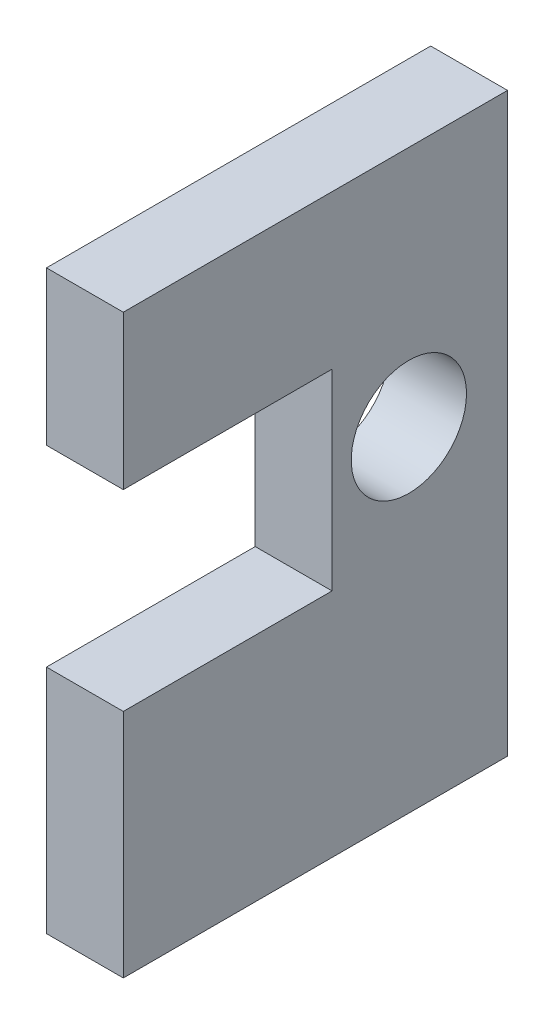
ISO-10303-21;
HEADER;
FILE_DESCRIPTION(('STEP AP214'),'2;1');
FILE_NAME('part.step','',(''),(''),'','','');
FILE_SCHEMA(('AUTOMOTIVE_DESIGN { 1 0 10303 214 1 1 1 1 }'));
ENDSEC;
DATA;
#1=APPLICATION_CONTEXT('core data for automotive mechanical design processes');
#2=APPLICATION_PROTOCOL_DEFINITION('international standard','automotive_design',2000,#1);
#3=PRODUCT_CONTEXT('',#1,'mechanical');
#4=PRODUCT('Part','Part','',(#3));
#5=PRODUCT_RELATED_PRODUCT_CATEGORY('part','',(#4));
#6=PRODUCT_DEFINITION_FORMATION('','',#4);
#7=PRODUCT_DEFINITION_CONTEXT('part definition',#1,'design');
#8=PRODUCT_DEFINITION('design','',#6,#7);
#9=PRODUCT_DEFINITION_SHAPE('','',#8);
#10=(LENGTH_UNIT() NAMED_UNIT(*) SI_UNIT(.MILLI.,.METRE.));
#11=(NAMED_UNIT(*) PLANE_ANGLE_UNIT() SI_UNIT($,.RADIAN.));
#12=(NAMED_UNIT(*) SI_UNIT($,.STERADIAN.) SOLID_ANGLE_UNIT());
#13=UNCERTAINTY_MEASURE_WITH_UNIT(LENGTH_MEASURE(1.E-05),#10,'distance_accuracy_value','');
#14=(GEOMETRIC_REPRESENTATION_CONTEXT(3) GLOBAL_UNCERTAINTY_ASSIGNED_CONTEXT((#13)) GLOBAL_UNIT_ASSIGNED_CONTEXT((#10,
#11,#12)) REPRESENTATION_CONTEXT('',''));
#15=CARTESIAN_POINT('',(0.,0.,0.));
#16=DIRECTION('',(0.,0.,1.));
#17=DIRECTION('',(1.,0.,0.));
#18=AXIS2_PLACEMENT_3D('',#15,#16,#17);
#19=CARTESIAN_POINT('',(2.,0.,0.));
#20=DIRECTION('',(1.,0.,0.));
#21=DIRECTION('',(0.,0.,-1.));
#22=AXIS2_PLACEMENT_3D('',#19,#20,#21);
#23=PLANE('',#22);
#24=DIRECTION('',(0.,1.,0.));
#25=VECTOR('',#24,1.);
#26=CARTESIAN_POINT('',(2.,-12.9799427142259,-5.));
#27=LINE('',#26,#25);
#28=CARTESIAN_POINT('',(2.,-12.9799427142259,-5.));
#29=VERTEX_POINT('',#28);
#30=CARTESIAN_POINT('',(2.,2.02702702702703,-5.));
#31=VERTEX_POINT('',#30);
#32=EDGE_CURVE('E164',#29,#31,#27,.T.);
#33=ORIENTED_EDGE('',*,*,#32,.T.);
#34=DIRECTION('',(0.,0.,1.));
#35=VECTOR('',#34,1.);
#36=CARTESIAN_POINT('',(2.,2.02702702702703,-5.));
#37=LINE('',#36,#35);
#38=CARTESIAN_POINT('',(2.,2.02702702702703,5.));
#39=VERTEX_POINT('',#38);
#40=EDGE_CURVE('E100',#31,#39,#37,.T.);
#41=ORIENTED_EDGE('',*,*,#40,.T.);
#42=DIRECTION('',(0.,-1.,0.));
#43=VECTOR('',#42,1.);
#44=CARTESIAN_POINT('',(2.,-1.97297297297297,5.));
#45=LINE('',#44,#43);
#46=CARTESIAN_POINT('',(2.,-1.97297297297297,5.));
#47=VERTEX_POINT('',#46);
#48=EDGE_CURVE('E185',#39,#47,#45,.T.);
#49=ORIENTED_EDGE('',*,*,#48,.T.);
#50=DIRECTION('',(0.,0.,-1.));
#51=VECTOR('',#50,1.);
#52=CARTESIAN_POINT('',(2.,-1.97297297297297,-0.432432432432427));
#53=LINE('',#52,#51);
#54=CARTESIAN_POINT('',(2.,-1.97297297297297,-0.432432432432427));
#55=VERTEX_POINT('',#54);
#56=EDGE_CURVE('E199',#47,#55,#53,.T.);
#57=ORIENTED_EDGE('',*,*,#56,.T.);
#58=DIRECTION('',(0.,-1.,0.));
#59=VECTOR('',#58,1.);
#60=CARTESIAN_POINT('',(2.,-6.97149936998687,-0.432432432432427));
#61=LINE('',#60,#59);
#62=CARTESIAN_POINT('',(2.,-6.97149936998687,-0.432432432432427));
#63=VERTEX_POINT('',#62);
#64=EDGE_CURVE('E119',#55,#63,#61,.T.);
#65=ORIENTED_EDGE('',*,*,#64,.T.);
#66=DIRECTION('',(0.,0.,1.));
#67=VECTOR('',#66,1.);
#68=CARTESIAN_POINT('',(2.,-6.97149936998687,-0.432432432432427));
#69=LINE('',#68,#67);
#70=CARTESIAN_POINT('',(2.,-6.97149936998687,5.));
#71=VERTEX_POINT('',#70);
#72=EDGE_CURVE('E113',#63,#71,#69,.T.);
#73=ORIENTED_EDGE('',*,*,#72,.T.);
#74=DIRECTION('',(0.,-1.,0.));
#75=VECTOR('',#74,1.);
#76=CARTESIAN_POINT('',(2.,-12.9799427142259,5.));
#77=LINE('',#76,#75);
#78=CARTESIAN_POINT('',(2.,-12.9799427142259,5.));
#79=VERTEX_POINT('',#78);
#80=EDGE_CURVE('E117',#71,#79,#77,.T.);
#81=ORIENTED_EDGE('',*,*,#80,.T.);
#82=DIRECTION('',(0.,0.,-1.));
#83=VECTOR('',#82,1.);
#84=CARTESIAN_POINT('',(2.,-12.9799427142259,-5.));
#85=LINE('',#84,#83);
#86=EDGE_CURVE('E57',#79,#29,#85,.T.);
#87=ORIENTED_EDGE('',*,*,#86,.T.);
#88=EDGE_LOOP('',(#33,#41,#49,#57,#65,#73,#81,#87));
#89=FACE_BOUND('',#88,.T.);
#90=CARTESIAN_POINT('',(2.,-4.27297297297297,-2.43243243243243));
#91=DIRECTION('',(1.,0.,0.));
#92=DIRECTION('',(0.,0.,-1.));
#93=AXIS2_PLACEMENT_3D('',#90,#91,#92);
#94=CIRCLE('',#93,1.5);
#95=CARTESIAN_POINT('',(2.,-4.27297297297297,-3.93243243243243));
#96=VERTEX_POINT('',#95);
#97=EDGE_CURVE('E146',#96,#96,#94,.T.);
#98=ORIENTED_EDGE('',*,*,#97,.F.);
#99=EDGE_LOOP('',(#98));
#100=FACE_BOUND('',#99,.T.);
#101=ADVANCED_FACE('F39',(#89,#100),#23,.T.);
#102=CARTESIAN_POINT('',(0.,0.,0.));
#103=DIRECTION('',(1.,0.,0.));
#104=DIRECTION('',(0.,0.,-1.));
#105=AXIS2_PLACEMENT_3D('',#102,#103,#104);
#106=PLANE('',#105);
#107=DIRECTION('',(0.,1.,0.));
#108=VECTOR('',#107,1.);
#109=CARTESIAN_POINT('',(0.,-12.9799427142259,-5.));
#110=LINE('',#109,#108);
#111=CARTESIAN_POINT('',(0.,-12.9799427142259,-5.));
#112=VERTEX_POINT('',#111);
#113=CARTESIAN_POINT('',(0.,2.02702702702703,-5.));
#114=VERTEX_POINT('',#113);
#115=EDGE_CURVE('E141',#112,#114,#110,.T.);
#116=ORIENTED_EDGE('',*,*,#115,.F.);
#117=DIRECTION('',(0.,0.,-1.));
#118=VECTOR('',#117,1.);
#119=CARTESIAN_POINT('',(0.,-12.9799427142259,-5.));
#120=LINE('',#119,#118);
#121=CARTESIAN_POINT('',(0.,-12.9799427142259,5.));
#122=VERTEX_POINT('',#121);
#123=EDGE_CURVE('E92',#122,#112,#120,.T.);
#124=ORIENTED_EDGE('',*,*,#123,.F.);
#125=DIRECTION('',(0.,-1.,0.));
#126=VECTOR('',#125,1.);
#127=CARTESIAN_POINT('',(0.,-12.9799427142259,5.));
#128=LINE('',#127,#126);
#129=CARTESIAN_POINT('',(0.,-6.97149936998687,5.));
#130=VERTEX_POINT('',#129);
#131=EDGE_CURVE('E86',#130,#122,#128,.T.);
#132=ORIENTED_EDGE('',*,*,#131,.F.);
#133=DIRECTION('',(0.,0.,1.));
#134=VECTOR('',#133,1.);
#135=CARTESIAN_POINT('',(0.,-6.97149936998687,-0.432432432432427));
#136=LINE('',#135,#134);
#137=CARTESIAN_POINT('',(0.,-6.97149936998687,-0.432432432432427));
#138=VERTEX_POINT('',#137);
#139=EDGE_CURVE('E128',#138,#130,#136,.T.);
#140=ORIENTED_EDGE('',*,*,#139,.F.);
#141=DIRECTION('',(0.,-1.,0.));
#142=VECTOR('',#141,1.);
#143=CARTESIAN_POINT('',(0.,-6.97149936998687,-0.432432432432427));
#144=LINE('',#143,#142);
#145=CARTESIAN_POINT('',(0.,-1.97297297297297,-0.432432432432427));
#146=VERTEX_POINT('',#145);
#147=EDGE_CURVE('E155',#146,#138,#144,.T.);
#148=ORIENTED_EDGE('',*,*,#147,.F.);
#149=DIRECTION('',(0.,0.,-1.));
#150=VECTOR('',#149,1.);
#151=CARTESIAN_POINT('',(0.,-1.97297297297297,-0.432432432432427));
#152=LINE('',#151,#150);
#153=CARTESIAN_POINT('',(0.,-1.97297297297297,5.));
#154=VERTEX_POINT('',#153);
#155=EDGE_CURVE('E152',#154,#146,#152,.T.);
#156=ORIENTED_EDGE('',*,*,#155,.F.);
#157=DIRECTION('',(0.,-1.,0.));
#158=VECTOR('',#157,1.);
#159=CARTESIAN_POINT('',(0.,-1.97297297297297,5.));
#160=LINE('',#159,#158);
#161=CARTESIAN_POINT('',(0.,2.02702702702703,5.));
#162=VERTEX_POINT('',#161);
#163=EDGE_CURVE('E149',#162,#154,#160,.T.);
#164=ORIENTED_EDGE('',*,*,#163,.F.);
#165=DIRECTION('',(0.,0.,1.));
#166=VECTOR('',#165,1.);
#167=CARTESIAN_POINT('',(0.,2.02702702702703,-5.));
#168=LINE('',#167,#166);
#169=EDGE_CURVE('E145',#114,#162,#168,.T.);
#170=ORIENTED_EDGE('',*,*,#169,.F.);
#171=EDGE_LOOP('',(#116,#124,#132,#140,#148,#156,#164,#170));
#172=FACE_BOUND('',#171,.T.);
#173=CARTESIAN_POINT('',(0.,-4.27297297297297,-2.43243243243243));
#174=DIRECTION('',(1.,0.,0.));
#175=DIRECTION('',(0.,0.,-1.));
#176=AXIS2_PLACEMENT_3D('',#173,#174,#175);
#177=CIRCLE('',#176,1.5);
#178=CARTESIAN_POINT('',(0.,-4.27297297297297,-3.93243243243243));
#179=VERTEX_POINT('',#178);
#180=EDGE_CURVE('E209',#179,#179,#177,.T.);
#181=ORIENTED_EDGE('',*,*,#180,.T.);
#182=EDGE_LOOP('',(#181));
#183=FACE_BOUND('',#182,.T.);
#184=ADVANCED_FACE('F189',(#172,#183),#106,.F.);
#185=CARTESIAN_POINT('',(2.,-12.9799427142259,-5.));
#186=DIRECTION('',(0.,0.,1.));
#187=DIRECTION('',(0.,-1.,0.));
#188=AXIS2_PLACEMENT_3D('',#185,#186,#187);
#189=PLANE('',#188);
#190=ORIENTED_EDGE('',*,*,#115,.T.);
#191=DIRECTION('',(-1.,0.,0.));
#192=VECTOR('',#191,1.);
#193=CARTESIAN_POINT('',(2.,2.02702702702703,-5.));
#194=LINE('',#193,#192);
#195=EDGE_CURVE('E11',#31,#114,#194,.T.);
#196=ORIENTED_EDGE('',*,*,#195,.F.);
#197=ORIENTED_EDGE('',*,*,#32,.F.);
#198=DIRECTION('',(-1.,0.,0.));
#199=VECTOR('',#198,1.);
#200=CARTESIAN_POINT('',(2.,-12.9799427142259,-5.));
#201=LINE('',#200,#199);
#202=EDGE_CURVE('E137',#29,#112,#201,.T.);
#203=ORIENTED_EDGE('',*,*,#202,.T.);
#204=EDGE_LOOP('',(#190,#196,#197,#203));
#205=FACE_BOUND('',#204,.T.);
#206=ADVANCED_FACE('F41',(#205),#189,.F.);
#207=CARTESIAN_POINT('',(2.,2.02702702702703,-5.));
#208=DIRECTION('',(0.,-1.,0.));
#209=DIRECTION('',(0.,0.,-1.));
#210=AXIS2_PLACEMENT_3D('',#207,#208,#209);
#211=PLANE('',#210);
#212=ORIENTED_EDGE('',*,*,#169,.T.);
#213=DIRECTION('',(-1.,0.,0.));
#214=VECTOR('',#213,1.);
#215=CARTESIAN_POINT('',(2.,2.02702702702703,5.));
#216=LINE('',#215,#214);
#217=EDGE_CURVE('E49',#39,#162,#216,.T.);
#218=ORIENTED_EDGE('',*,*,#217,.F.);
#219=ORIENTED_EDGE('',*,*,#40,.F.);
#220=ORIENTED_EDGE('',*,*,#195,.T.);
#221=EDGE_LOOP('',(#212,#218,#219,#220));
#222=FACE_BOUND('',#221,.T.);
#223=ADVANCED_FACE('F239',(#222),#211,.F.);
#224=CARTESIAN_POINT('',(2.,-1.97297297297297,5.));
#225=DIRECTION('',(0.,0.,-1.));
#226=DIRECTION('',(0.,1.,0.));
#227=AXIS2_PLACEMENT_3D('',#224,#225,#226);
#228=PLANE('',#227);
#229=ORIENTED_EDGE('',*,*,#163,.T.);
#230=DIRECTION('',(-1.,0.,0.));
#231=VECTOR('',#230,1.);
#232=CARTESIAN_POINT('',(2.,-1.97297297297297,5.));
#233=LINE('',#232,#231);
#234=EDGE_CURVE('E175',#47,#154,#233,.T.);
#235=ORIENTED_EDGE('',*,*,#234,.F.);
#236=ORIENTED_EDGE('',*,*,#48,.F.);
#237=ORIENTED_EDGE('',*,*,#217,.T.);
#238=EDGE_LOOP('',(#229,#235,#236,#237));
#239=FACE_BOUND('',#238,.T.);
#240=ADVANCED_FACE('F183',(#239),#228,.F.);
#241=CARTESIAN_POINT('',(2.,-1.97297297297297,-0.432432432432427));
#242=DIRECTION('',(0.,1.,0.));
#243=DIRECTION('',(0.,0.,1.));
#244=AXIS2_PLACEMENT_3D('',#241,#242,#243);
#245=PLANE('',#244);
#246=ORIENTED_EDGE('',*,*,#155,.T.);
#247=DIRECTION('',(-1.,0.,0.));
#248=VECTOR('',#247,1.);
#249=CARTESIAN_POINT('',(2.,-1.97297297297297,-0.432432432432427));
#250=LINE('',#249,#248);
#251=EDGE_CURVE('E171',#55,#146,#250,.T.);
#252=ORIENTED_EDGE('',*,*,#251,.F.);
#253=ORIENTED_EDGE('',*,*,#56,.F.);
#254=ORIENTED_EDGE('',*,*,#234,.T.);
#255=EDGE_LOOP('',(#246,#252,#253,#254));
#256=FACE_BOUND('',#255,.T.);
#257=ADVANCED_FACE('F194',(#256),#245,.F.);
#258=CARTESIAN_POINT('',(2.,-6.97149936998687,-0.432432432432427));
#259=DIRECTION('',(0.,0.,-1.));
#260=DIRECTION('',(0.,1.,0.));
#261=AXIS2_PLACEMENT_3D('',#258,#259,#260);
#262=PLANE('',#261);
#263=ORIENTED_EDGE('',*,*,#147,.T.);
#264=DIRECTION('',(-1.,0.,0.));
#265=VECTOR('',#264,1.);
#266=CARTESIAN_POINT('',(2.,-6.97149936998687,-0.432432432432427));
#267=LINE('',#266,#265);
#268=EDGE_CURVE('E130',#63,#138,#267,.T.);
#269=ORIENTED_EDGE('',*,*,#268,.F.);
#270=ORIENTED_EDGE('',*,*,#64,.F.);
#271=ORIENTED_EDGE('',*,*,#251,.T.);
#272=EDGE_LOOP('',(#263,#269,#270,#271));
#273=FACE_BOUND('',#272,.T.);
#274=ADVANCED_FACE('F197',(#273),#262,.F.);
#275=CARTESIAN_POINT('',(2.,-6.97149936998687,-0.432432432432427));
#276=DIRECTION('',(0.,-1.,0.));
#277=DIRECTION('',(0.,0.,-1.));
#278=AXIS2_PLACEMENT_3D('',#275,#276,#277);
#279=PLANE('',#278);
#280=ORIENTED_EDGE('',*,*,#139,.T.);
#281=DIRECTION('',(-1.,0.,0.));
#282=VECTOR('',#281,1.);
#283=CARTESIAN_POINT('',(2.,-6.97149936998687,5.));
#284=LINE('',#283,#282);
#285=EDGE_CURVE('E125',#71,#130,#284,.T.);
#286=ORIENTED_EDGE('',*,*,#285,.F.);
#287=ORIENTED_EDGE('',*,*,#72,.F.);
#288=ORIENTED_EDGE('',*,*,#268,.T.);
#289=EDGE_LOOP('',(#280,#286,#287,#288));
#290=FACE_BOUND('',#289,.T.);
#291=ADVANCED_FACE('F126',(#290),#279,.F.);
#292=CARTESIAN_POINT('',(2.,-12.9799427142259,5.));
#293=DIRECTION('',(0.,0.,-1.));
#294=DIRECTION('',(0.,1.,0.));
#295=AXIS2_PLACEMENT_3D('',#292,#293,#294);
#296=PLANE('',#295);
#297=ORIENTED_EDGE('',*,*,#131,.T.);
#298=DIRECTION('',(-1.,0.,0.));
#299=VECTOR('',#298,1.);
#300=CARTESIAN_POINT('',(2.,-12.9799427142259,5.));
#301=LINE('',#300,#299);
#302=EDGE_CURVE('E131',#79,#122,#301,.T.);
#303=ORIENTED_EDGE('',*,*,#302,.F.);
#304=ORIENTED_EDGE('',*,*,#80,.F.);
#305=ORIENTED_EDGE('',*,*,#285,.T.);
#306=EDGE_LOOP('',(#297,#303,#304,#305));
#307=FACE_BOUND('',#306,.T.);
#308=ADVANCED_FACE('F133',(#307),#296,.F.);
#309=CARTESIAN_POINT('',(2.,-12.9799427142259,-5.));
#310=DIRECTION('',(0.,1.,0.));
#311=DIRECTION('',(0.,0.,1.));
#312=AXIS2_PLACEMENT_3D('',#309,#310,#311);
#313=PLANE('',#312);
#314=ORIENTED_EDGE('',*,*,#123,.T.);
#315=ORIENTED_EDGE('',*,*,#202,.F.);
#316=ORIENTED_EDGE('',*,*,#86,.F.);
#317=ORIENTED_EDGE('',*,*,#302,.T.);
#318=EDGE_LOOP('',(#314,#315,#316,#317));
#319=FACE_BOUND('',#318,.T.);
#320=ADVANCED_FACE('F227',(#319),#313,.F.);
#321=CARTESIAN_POINT('',(2.,-4.27297297297297,-2.43243243243243));
#322=DIRECTION('',(-1.,0.,0.));
#323=DIRECTION('',(0.,0.,1.));
#324=AXIS2_PLACEMENT_3D('',#321,#322,#323);
#325=CYLINDRICAL_SURFACE('',#324,1.5);
#326=ORIENTED_EDGE('',*,*,#97,.T.);
#327=EDGE_LOOP('',(#326));
#328=FACE_BOUND('',#327,.T.);
#329=ORIENTED_EDGE('',*,*,#180,.F.);
#330=EDGE_LOOP('',(#329));
#331=FACE_BOUND('',#330,.T.);
#332=ADVANCED_FACE('F217',(#328,#331),#325,.F.);
#333=CLOSED_SHELL('',(#101,#184,#206,#223,#240,#257,#274,#291,#308,#320,#332));
#334=MANIFOLD_SOLID_BREP('B2',#333);
#335=ADVANCED_BREP_SHAPE_REPRESENTATION('',(#18,#334),#14);
#336=SHAPE_DEFINITION_REPRESENTATION(#9,#335);
ENDSEC;
END-ISO-10303-21;
